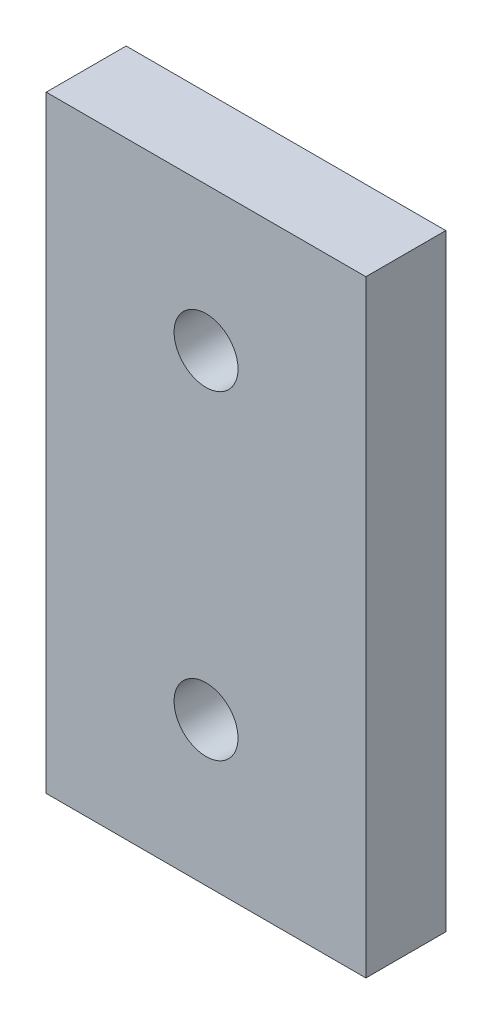
ISO-10303-21;
HEADER;
FILE_DESCRIPTION(('STEP AP214'),'2;1');
FILE_NAME('part.step','',(''),(''),'','','');
FILE_SCHEMA(('AUTOMOTIVE_DESIGN { 1 0 10303 214 1 1 1 1 }'));
ENDSEC;
DATA;
#1=APPLICATION_CONTEXT('core data for automotive mechanical design processes');
#2=APPLICATION_PROTOCOL_DEFINITION('international standard','automotive_design',2000,#1);
#3=PRODUCT_CONTEXT('',#1,'mechanical');
#4=PRODUCT('Part','Part','',(#3));
#5=PRODUCT_RELATED_PRODUCT_CATEGORY('part','',(#4));
#6=PRODUCT_DEFINITION_FORMATION('','',#4);
#7=PRODUCT_DEFINITION_CONTEXT('part definition',#1,'design');
#8=PRODUCT_DEFINITION('design','',#6,#7);
#9=PRODUCT_DEFINITION_SHAPE('','',#8);
#10=(LENGTH_UNIT() NAMED_UNIT(*) SI_UNIT(.MILLI.,.METRE.));
#11=(NAMED_UNIT(*) PLANE_ANGLE_UNIT() SI_UNIT($,.RADIAN.));
#12=(NAMED_UNIT(*) SI_UNIT($,.STERADIAN.) SOLID_ANGLE_UNIT());
#13=UNCERTAINTY_MEASURE_WITH_UNIT(LENGTH_MEASURE(1.E-05),#10,'distance_accuracy_value','');
#14=(GEOMETRIC_REPRESENTATION_CONTEXT(3) GLOBAL_UNCERTAINTY_ASSIGNED_CONTEXT((#13)) GLOBAL_UNIT_ASSIGNED_CONTEXT((#10,
#11,#12)) REPRESENTATION_CONTEXT('',''));
#15=CARTESIAN_POINT('',(0.,0.,0.));
#16=DIRECTION('',(0.,0.,1.));
#17=DIRECTION('',(1.,0.,0.));
#18=AXIS2_PLACEMENT_3D('',#15,#16,#17);
#19=CARTESIAN_POINT('',(0.,0.,5.));
#20=DIRECTION('',(0.,0.,-1.));
#21=DIRECTION('',(-1.,0.,0.));
#22=AXIS2_PLACEMENT_3D('',#19,#20,#21);
#23=PLANE('',#22);
#24=DIRECTION('',(0.,1.,0.));
#25=VECTOR('',#24,1.);
#26=CARTESIAN_POINT('',(10.,-19.,5.));
#27=LINE('',#26,#25);
#28=CARTESIAN_POINT('',(10.,-19.,5.));
#29=VERTEX_POINT('',#28);
#30=CARTESIAN_POINT('',(10.,19.,5.));
#31=VERTEX_POINT('',#30);
#32=EDGE_CURVE('E84',#29,#31,#27,.T.);
#33=ORIENTED_EDGE('',*,*,#32,.T.);
#34=DIRECTION('',(-1.,0.,0.));
#35=VECTOR('',#34,1.);
#36=CARTESIAN_POINT('',(-10.,19.,5.));
#37=LINE('',#36,#35);
#38=CARTESIAN_POINT('',(-10.,19.,5.));
#39=VERTEX_POINT('',#38);
#40=EDGE_CURVE('E79',#31,#39,#37,.T.);
#41=ORIENTED_EDGE('',*,*,#40,.T.);
#42=DIRECTION('',(0.,-1.,0.));
#43=VECTOR('',#42,1.);
#44=CARTESIAN_POINT('',(-10.,-19.,5.));
#45=LINE('',#44,#43);
#46=CARTESIAN_POINT('',(-10.,-19.,5.));
#47=VERTEX_POINT('',#46);
#48=EDGE_CURVE('E82',#39,#47,#45,.T.);
#49=ORIENTED_EDGE('',*,*,#48,.T.);
#50=DIRECTION('',(1.,0.,0.));
#51=VECTOR('',#50,1.);
#52=CARTESIAN_POINT('',(-10.,-19.,5.));
#53=LINE('',#52,#51);
#54=EDGE_CURVE('E49',#47,#29,#53,.T.);
#55=ORIENTED_EDGE('',*,*,#54,.T.);
#56=EDGE_LOOP('',(#33,#41,#49,#55));
#57=FACE_BOUND('',#56,.T.);
#58=CARTESIAN_POINT('',(0.,10.,5.));
#59=DIRECTION('',(0.,0.,1.));
#60=DIRECTION('',(1.,0.,0.));
#61=AXIS2_PLACEMENT_3D('',#58,#59,#60);
#62=CIRCLE('',#61,2.);
#63=CARTESIAN_POINT('',(2.,10.,5.));
#64=VERTEX_POINT('',#63);
#65=EDGE_CURVE('E99',#64,#64,#62,.T.);
#66=ORIENTED_EDGE('',*,*,#65,.F.);
#67=EDGE_LOOP('',(#66));
#68=FACE_BOUND('',#67,.T.);
#69=CARTESIAN_POINT('',(0.,-10.,5.));
#70=DIRECTION('',(0.,0.,1.));
#71=DIRECTION('',(1.,0.,0.));
#72=AXIS2_PLACEMENT_3D('',#69,#70,#71);
#73=CIRCLE('',#72,2.);
#74=CARTESIAN_POINT('',(2.,-10.,5.));
#75=VERTEX_POINT('',#74);
#76=EDGE_CURVE('E114',#75,#75,#73,.T.);
#77=ORIENTED_EDGE('',*,*,#76,.F.);
#78=EDGE_LOOP('',(#77));
#79=FACE_BOUND('',#78,.T.);
#80=ADVANCED_FACE('F32',(#57,#68,#79),#23,.F.);
#81=CARTESIAN_POINT('',(0.,0.,0.));
#82=DIRECTION('',(0.,0.,-1.));
#83=DIRECTION('',(-1.,0.,0.));
#84=AXIS2_PLACEMENT_3D('',#81,#82,#83);
#85=PLANE('',#84);
#86=CARTESIAN_POINT('',(0.,10.,0.));
#87=DIRECTION('',(0.,0.,1.));
#88=DIRECTION('',(1.,0.,0.));
#89=AXIS2_PLACEMENT_3D('',#86,#87,#88);
#90=CIRCLE('',#89,2.);
#91=CARTESIAN_POINT('',(2.,10.,0.));
#92=VERTEX_POINT('',#91);
#93=EDGE_CURVE('E111',#92,#92,#90,.T.);
#94=ORIENTED_EDGE('',*,*,#93,.T.);
#95=EDGE_LOOP('',(#94));
#96=FACE_BOUND('',#95,.T.);
#97=DIRECTION('',(0.,1.,0.));
#98=VECTOR('',#97,1.);
#99=CARTESIAN_POINT('',(10.,-19.,0.));
#100=LINE('',#99,#98);
#101=CARTESIAN_POINT('',(10.,-19.,0.));
#102=VERTEX_POINT('',#101);
#103=CARTESIAN_POINT('',(10.,19.,0.));
#104=VERTEX_POINT('',#103);
#105=EDGE_CURVE('E96',#102,#104,#100,.T.);
#106=ORIENTED_EDGE('',*,*,#105,.F.);
#107=DIRECTION('',(1.,0.,0.));
#108=VECTOR('',#107,1.);
#109=CARTESIAN_POINT('',(-10.,-19.,0.));
#110=LINE('',#109,#108);
#111=CARTESIAN_POINT('',(-10.,-19.,0.));
#112=VERTEX_POINT('',#111);
#113=EDGE_CURVE('E72',#112,#102,#110,.T.);
#114=ORIENTED_EDGE('',*,*,#113,.F.);
#115=DIRECTION('',(0.,-1.,0.));
#116=VECTOR('',#115,1.);
#117=CARTESIAN_POINT('',(-10.,-19.,0.));
#118=LINE('',#117,#116);
#119=CARTESIAN_POINT('',(-10.,19.,0.));
#120=VERTEX_POINT('',#119);
#121=EDGE_CURVE('E66',#120,#112,#118,.T.);
#122=ORIENTED_EDGE('',*,*,#121,.F.);
#123=DIRECTION('',(-1.,0.,0.));
#124=VECTOR('',#123,1.);
#125=CARTESIAN_POINT('',(-10.,19.,0.));
#126=LINE('',#125,#124);
#127=EDGE_CURVE('E88',#104,#120,#126,.T.);
#128=ORIENTED_EDGE('',*,*,#127,.F.);
#129=EDGE_LOOP('',(#106,#114,#122,#128));
#130=FACE_BOUND('',#129,.T.);
#131=CARTESIAN_POINT('',(0.,-10.,0.));
#132=DIRECTION('',(0.,0.,1.));
#133=DIRECTION('',(1.,0.,0.));
#134=AXIS2_PLACEMENT_3D('',#131,#132,#133);
#135=CIRCLE('',#134,2.);
#136=CARTESIAN_POINT('',(2.,-10.,0.));
#137=VERTEX_POINT('',#136);
#138=EDGE_CURVE('E117',#137,#137,#135,.T.);
#139=ORIENTED_EDGE('',*,*,#138,.T.);
#140=EDGE_LOOP('',(#139));
#141=FACE_BOUND('',#140,.T.);
#142=ADVANCED_FACE('F107',(#96,#130,#141),#85,.T.);
#143=CARTESIAN_POINT('',(10.,-19.,5.));
#144=DIRECTION('',(-1.,0.,0.));
#145=DIRECTION('',(0.,0.,1.));
#146=AXIS2_PLACEMENT_3D('',#143,#144,#145);
#147=PLANE('',#146);
#148=ORIENTED_EDGE('',*,*,#105,.T.);
#149=DIRECTION('',(0.,0.,-1.));
#150=VECTOR('',#149,1.);
#151=CARTESIAN_POINT('',(10.,19.,5.));
#152=LINE('',#151,#150);
#153=EDGE_CURVE('E11',#31,#104,#152,.T.);
#154=ORIENTED_EDGE('',*,*,#153,.F.);
#155=ORIENTED_EDGE('',*,*,#32,.F.);
#156=DIRECTION('',(0.,0.,-1.));
#157=VECTOR('',#156,1.);
#158=CARTESIAN_POINT('',(10.,-19.,5.));
#159=LINE('',#158,#157);
#160=EDGE_CURVE('E92',#29,#102,#159,.T.);
#161=ORIENTED_EDGE('',*,*,#160,.T.);
#162=EDGE_LOOP('',(#148,#154,#155,#161));
#163=FACE_BOUND('',#162,.T.);
#164=ADVANCED_FACE('F34',(#163),#147,.F.);
#165=CARTESIAN_POINT('',(-10.,19.,5.));
#166=DIRECTION('',(0.,-1.,0.));
#167=DIRECTION('',(0.,0.,-1.));
#168=AXIS2_PLACEMENT_3D('',#165,#166,#167);
#169=PLANE('',#168);
#170=ORIENTED_EDGE('',*,*,#127,.T.);
#171=DIRECTION('',(0.,0.,-1.));
#172=VECTOR('',#171,1.);
#173=CARTESIAN_POINT('',(-10.,19.,5.));
#174=LINE('',#173,#172);
#175=EDGE_CURVE('E41',#39,#120,#174,.T.);
#176=ORIENTED_EDGE('',*,*,#175,.F.);
#177=ORIENTED_EDGE('',*,*,#40,.F.);
#178=ORIENTED_EDGE('',*,*,#153,.T.);
#179=EDGE_LOOP('',(#170,#176,#177,#178));
#180=FACE_BOUND('',#179,.T.);
#181=ADVANCED_FACE('F87',(#180),#169,.F.);
#182=CARTESIAN_POINT('',(-10.,-19.,5.));
#183=DIRECTION('',(1.,0.,0.));
#184=DIRECTION('',(0.,0.,-1.));
#185=AXIS2_PLACEMENT_3D('',#182,#183,#184);
#186=PLANE('',#185);
#187=ORIENTED_EDGE('',*,*,#121,.T.);
#188=DIRECTION('',(0.,0.,-1.));
#189=VECTOR('',#188,1.);
#190=CARTESIAN_POINT('',(-10.,-19.,5.));
#191=LINE('',#190,#189);
#192=EDGE_CURVE('E89',#47,#112,#191,.T.);
#193=ORIENTED_EDGE('',*,*,#192,.F.);
#194=ORIENTED_EDGE('',*,*,#48,.F.);
#195=ORIENTED_EDGE('',*,*,#175,.T.);
#196=EDGE_LOOP('',(#187,#193,#194,#195));
#197=FACE_BOUND('',#196,.T.);
#198=ADVANCED_FACE('F90',(#197),#186,.F.);
#199=CARTESIAN_POINT('',(-10.,-19.,5.));
#200=DIRECTION('',(0.,1.,0.));
#201=DIRECTION('',(0.,0.,1.));
#202=AXIS2_PLACEMENT_3D('',#199,#200,#201);
#203=PLANE('',#202);
#204=ORIENTED_EDGE('',*,*,#113,.T.);
#205=ORIENTED_EDGE('',*,*,#160,.F.);
#206=ORIENTED_EDGE('',*,*,#54,.F.);
#207=ORIENTED_EDGE('',*,*,#192,.T.);
#208=EDGE_LOOP('',(#204,#205,#206,#207));
#209=FACE_BOUND('',#208,.T.);
#210=ADVANCED_FACE('F104',(#209),#203,.F.);
#211=CARTESIAN_POINT('',(0.,10.,5.));
#212=DIRECTION('',(0.,0.,-1.));
#213=DIRECTION('',(-1.,0.,0.));
#214=AXIS2_PLACEMENT_3D('',#211,#212,#213);
#215=CYLINDRICAL_SURFACE('',#214,2.);
#216=ORIENTED_EDGE('',*,*,#65,.T.);
#217=EDGE_LOOP('',(#216));
#218=FACE_BOUND('',#217,.T.);
#219=ORIENTED_EDGE('',*,*,#93,.F.);
#220=EDGE_LOOP('',(#219));
#221=FACE_BOUND('',#220,.T.);
#222=ADVANCED_FACE('F134',(#218,#221),#215,.F.);
#223=CARTESIAN_POINT('',(0.,-10.,5.));
#224=DIRECTION('',(0.,0.,-1.));
#225=DIRECTION('',(-1.,0.,0.));
#226=AXIS2_PLACEMENT_3D('',#223,#224,#225);
#227=CYLINDRICAL_SURFACE('',#226,2.);
#228=ORIENTED_EDGE('',*,*,#76,.T.);
#229=EDGE_LOOP('',(#228));
#230=FACE_BOUND('',#229,.T.);
#231=ORIENTED_EDGE('',*,*,#138,.F.);
#232=EDGE_LOOP('',(#231));
#233=FACE_BOUND('',#232,.T.);
#234=ADVANCED_FACE('F123',(#230,#233),#227,.F.);
#235=CLOSED_SHELL('',(#80,#142,#164,#181,#198,#210,#222,#234));
#236=MANIFOLD_SOLID_BREP('B2',#235);
#237=ADVANCED_BREP_SHAPE_REPRESENTATION('',(#18,#236),#14);
#238=SHAPE_DEFINITION_REPRESENTATION(#9,#237);
ENDSEC;
END-ISO-10303-21;
